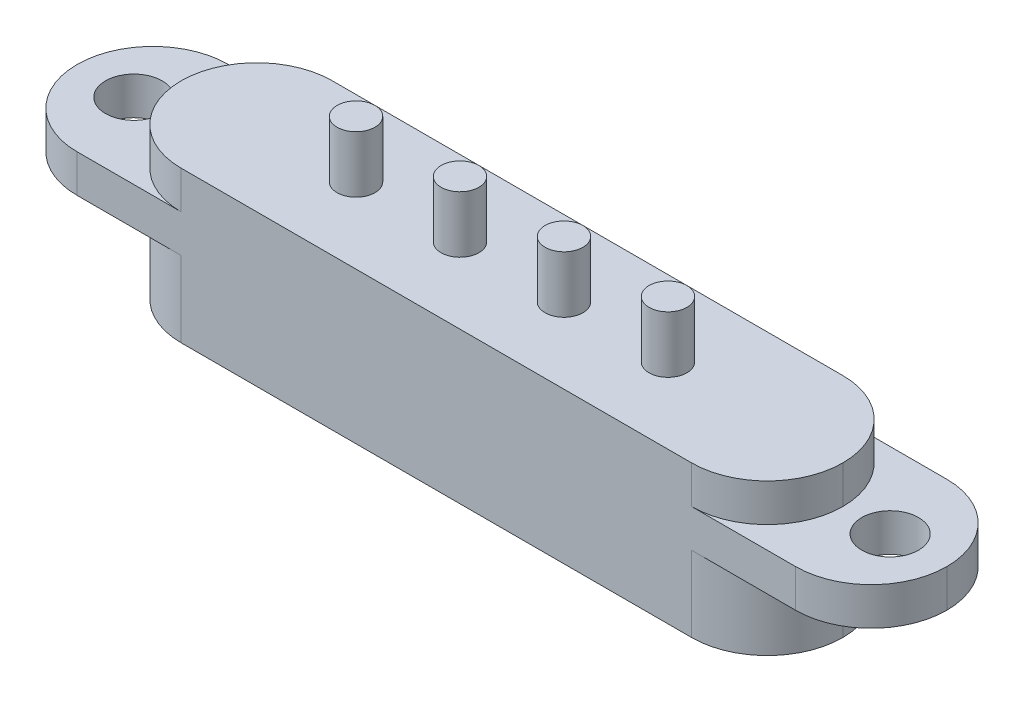
ISO-10303-21;
HEADER;
FILE_DESCRIPTION(('STEP AP214'),'2;1');
FILE_NAME('part.step','',(''),(''),'','','');
FILE_SCHEMA(('AUTOMOTIVE_DESIGN { 1 0 10303 214 1 1 1 1 }'));
ENDSEC;
DATA;
#1=APPLICATION_CONTEXT('core data for automotive mechanical design processes');
#2=APPLICATION_PROTOCOL_DEFINITION('international standard','automotive_design',2000,#1);
#3=PRODUCT_CONTEXT('',#1,'mechanical');
#4=PRODUCT('Part','Part','',(#3));
#5=PRODUCT_RELATED_PRODUCT_CATEGORY('part','',(#4));
#6=PRODUCT_DEFINITION_FORMATION('','',#4);
#7=PRODUCT_DEFINITION_CONTEXT('part definition',#1,'design');
#8=PRODUCT_DEFINITION('design','',#6,#7);
#9=PRODUCT_DEFINITION_SHAPE('','',#8);
#10=(LENGTH_UNIT() NAMED_UNIT(*) SI_UNIT(.MILLI.,.METRE.));
#11=(NAMED_UNIT(*) PLANE_ANGLE_UNIT() SI_UNIT($,.RADIAN.));
#12=(NAMED_UNIT(*) SI_UNIT($,.STERADIAN.) SOLID_ANGLE_UNIT());
#13=UNCERTAINTY_MEASURE_WITH_UNIT(LENGTH_MEASURE(1.E-05),#10,'distance_accuracy_value','');
#14=(GEOMETRIC_REPRESENTATION_CONTEXT(3) GLOBAL_UNCERTAINTY_ASSIGNED_CONTEXT((#13)) GLOBAL_UNIT_ASSIGNED_CONTEXT((#10,
#11,#12)) REPRESENTATION_CONTEXT('',''));
#15=CARTESIAN_POINT('',(0.,0.,0.));
#16=DIRECTION('',(0.,0.,1.));
#17=DIRECTION('',(1.,0.,0.));
#18=AXIS2_PLACEMENT_3D('',#15,#16,#17);
#19=CARTESIAN_POINT('',(0.,0.,0.));
#20=DIRECTION('',(0.,1.,0.));
#21=DIRECTION('',(0.,0.,1.));
#22=AXIS2_PLACEMENT_3D('',#19,#20,#21);
#23=PLANE('',#22);
#24=CARTESIAN_POINT('',(1.5,0.,2.));
#25=DIRECTION('',(0.,1.,0.));
#26=DIRECTION('',(0.,0.,1.));
#27=AXIS2_PLACEMENT_3D('',#24,#25,#26);
#28=CIRCLE('',#27,0.75);
#29=CARTESIAN_POINT('',(1.5,0.,2.75));
#30=VERTEX_POINT('',#29);
#31=EDGE_CURVE('E286',#30,#30,#28,.T.);
#32=ORIENTED_EDGE('',*,*,#31,.T.);
#33=EDGE_LOOP('',(#32));
#34=FACE_BOUND('',#33,.T.);
#35=DIRECTION('',(1.,0.,0.));
#36=VECTOR('',#35,1.);
#37=CARTESIAN_POINT('',(0.,0.,4.));
#38=LINE('',#37,#36);
#39=CARTESIAN_POINT('',(2.,0.,4.));
#40=VERTEX_POINT('',#39);
#41=CARTESIAN_POINT('',(4.75,0.,4.));
#42=VERTEX_POINT('',#41);
#43=EDGE_CURVE('E281',#40,#42,#38,.T.);
#44=ORIENTED_EDGE('',*,*,#43,.F.);
#45=CARTESIAN_POINT('',(2.,0.,2.));
#46=DIRECTION('',(0.,1.,0.));
#47=DIRECTION('',(0.,0.,1.));
#48=AXIS2_PLACEMENT_3D('',#45,#46,#47);
#49=CIRCLE('',#48,2.);
#50=CARTESIAN_POINT('',(0.,0.,2.));
#51=VERTEX_POINT('',#50);
#52=EDGE_CURVE('E254',#40,#51,#49,.F.);
#53=ORIENTED_EDGE('',*,*,#52,.T.);
#54=CARTESIAN_POINT('',(2.,0.,2.));
#55=DIRECTION('',(0.,1.,0.));
#56=DIRECTION('',(0.,0.,1.));
#57=AXIS2_PLACEMENT_3D('',#54,#55,#56);
#58=CIRCLE('',#57,2.);
#59=CARTESIAN_POINT('',(2.,0.,0.));
#60=VERTEX_POINT('',#59);
#61=EDGE_CURVE('E252',#51,#60,#58,.F.);
#62=ORIENTED_EDGE('',*,*,#61,.T.);
#63=DIRECTION('',(-1.,0.,0.));
#64=VECTOR('',#63,1.);
#65=CARTESIAN_POINT('',(0.,0.,0.));
#66=LINE('',#65,#64);
#67=CARTESIAN_POINT('',(4.75,0.,0.));
#68=VERTEX_POINT('',#67);
#69=EDGE_CURVE('E284',#68,#60,#66,.T.);
#70=ORIENTED_EDGE('',*,*,#69,.F.);
#71=CARTESIAN_POINT('',(4.75,0.,2.));
#72=DIRECTION('',(0.,1.,0.));
#73=DIRECTION('',(0.,0.,1.));
#74=AXIS2_PLACEMENT_3D('',#71,#72,#73);
#75=CIRCLE('',#74,2.);
#76=CARTESIAN_POINT('',(2.75,0.,2.));
#77=VERTEX_POINT('',#76);
#78=EDGE_CURVE('E229',#68,#77,#75,.T.);
#79=ORIENTED_EDGE('',*,*,#78,.T.);
#80=CARTESIAN_POINT('',(4.75,0.,2.));
#81=DIRECTION('',(0.,1.,0.));
#82=DIRECTION('',(0.,0.,1.));
#83=AXIS2_PLACEMENT_3D('',#80,#81,#82);
#84=CIRCLE('',#83,2.);
#85=EDGE_CURVE('E231',#77,#42,#84,.T.);
#86=ORIENTED_EDGE('',*,*,#85,.T.);
#87=EDGE_LOOP('',(#44,#53,#62,#70,#79,#86));
#88=FACE_BOUND('',#87,.T.);
#89=ADVANCED_FACE('F33',(#34,#88),#23,.F.);
#90=CARTESIAN_POINT('',(21.5,0.,2.));
#91=DIRECTION('',(0.,1.,0.));
#92=DIRECTION('',(0.,0.,1.));
#93=AXIS2_PLACEMENT_3D('',#90,#91,#92);
#94=CIRCLE('',#93,0.750000000000002);
#95=CARTESIAN_POINT('',(21.5,0.,2.75));
#96=VERTEX_POINT('',#95);
#97=EDGE_CURVE('E326',#96,#96,#94,.T.);
#98=ORIENTED_EDGE('',*,*,#97,.T.);
#99=EDGE_LOOP('',(#98));
#100=FACE_BOUND('',#99,.T.);
#101=CARTESIAN_POINT('',(21.,0.,0.));
#102=VERTEX_POINT('',#101);
#103=CARTESIAN_POINT('',(18.25,0.,0.));
#104=VERTEX_POINT('',#103);
#105=EDGE_CURVE('E292',#102,#104,#66,.T.);
#106=ORIENTED_EDGE('',*,*,#105,.F.);
#107=CARTESIAN_POINT('',(21.,0.,2.));
#108=DIRECTION('',(0.,1.,0.));
#109=DIRECTION('',(0.,0.,1.));
#110=AXIS2_PLACEMENT_3D('',#107,#108,#109);
#111=CIRCLE('',#110,2.);
#112=CARTESIAN_POINT('',(23.,0.,2.));
#113=VERTEX_POINT('',#112);
#114=EDGE_CURVE('E56',#102,#113,#111,.F.);
#115=ORIENTED_EDGE('',*,*,#114,.T.);
#116=CARTESIAN_POINT('',(21.,0.,2.));
#117=DIRECTION('',(0.,1.,0.));
#118=DIRECTION('',(0.,0.,1.));
#119=AXIS2_PLACEMENT_3D('',#116,#117,#118);
#120=CIRCLE('',#119,2.);
#121=CARTESIAN_POINT('',(21.,0.,4.));
#122=VERTEX_POINT('',#121);
#123=EDGE_CURVE('E265',#113,#122,#120,.F.);
#124=ORIENTED_EDGE('',*,*,#123,.T.);
#125=CARTESIAN_POINT('',(18.25,0.,4.));
#126=VERTEX_POINT('',#125);
#127=EDGE_CURVE('E280',#126,#122,#38,.T.);
#128=ORIENTED_EDGE('',*,*,#127,.F.);
#129=CARTESIAN_POINT('',(18.25,0.,2.));
#130=DIRECTION('',(0.,1.,0.));
#131=DIRECTION('',(0.,0.,1.));
#132=AXIS2_PLACEMENT_3D('',#129,#130,#131);
#133=CIRCLE('',#132,2.);
#134=CARTESIAN_POINT('',(20.25,0.,2.));
#135=VERTEX_POINT('',#134);
#136=EDGE_CURVE('E186',#126,#135,#133,.T.);
#137=ORIENTED_EDGE('',*,*,#136,.T.);
#138=CARTESIAN_POINT('',(18.25,0.,2.));
#139=DIRECTION('',(0.,1.,0.));
#140=DIRECTION('',(0.,0.,1.));
#141=AXIS2_PLACEMENT_3D('',#138,#139,#140);
#142=CIRCLE('',#141,2.);
#143=EDGE_CURVE('E216',#135,#104,#142,.T.);
#144=ORIENTED_EDGE('',*,*,#143,.T.);
#145=EDGE_LOOP('',(#106,#115,#124,#128,#137,#144));
#146=FACE_BOUND('',#145,.T.);
#147=ADVANCED_FACE('F279',(#100,#146),#23,.F.);
#148=CARTESIAN_POINT('',(0.,1.,0.));
#149=DIRECTION('',(0.,1.,0.));
#150=DIRECTION('',(0.,0.,1.));
#151=AXIS2_PLACEMENT_3D('',#148,#149,#150);
#152=PLANE('',#151);
#153=CARTESIAN_POINT('',(2.,1.,2.));
#154=DIRECTION('',(0.,1.,0.));
#155=DIRECTION('',(0.,0.,1.));
#156=AXIS2_PLACEMENT_3D('',#153,#154,#155);
#157=CIRCLE('',#156,2.);
#158=CARTESIAN_POINT('',(2.,1.,0.));
#159=VERTEX_POINT('',#158);
#160=CARTESIAN_POINT('',(0.,1.,2.));
#161=VERTEX_POINT('',#160);
#162=EDGE_CURVE('E256',#159,#161,#157,.T.);
#163=ORIENTED_EDGE('',*,*,#162,.T.);
#164=CARTESIAN_POINT('',(2.,1.,2.));
#165=DIRECTION('',(0.,1.,0.));
#166=DIRECTION('',(0.,0.,1.));
#167=AXIS2_PLACEMENT_3D('',#164,#165,#166);
#168=CIRCLE('',#167,2.);
#169=CARTESIAN_POINT('',(2.,1.,4.));
#170=VERTEX_POINT('',#169);
#171=EDGE_CURVE('E258',#161,#170,#168,.T.);
#172=ORIENTED_EDGE('',*,*,#171,.T.);
#173=DIRECTION('',(1.,0.,0.));
#174=VECTOR('',#173,1.);
#175=CARTESIAN_POINT('',(0.,1.,4.));
#176=LINE('',#175,#174);
#177=CARTESIAN_POINT('',(4.75,1.,4.));
#178=VERTEX_POINT('',#177);
#179=EDGE_CURVE('E298',#170,#178,#176,.T.);
#180=ORIENTED_EDGE('',*,*,#179,.T.);
#181=CARTESIAN_POINT('',(4.75,1.,2.));
#182=DIRECTION('',(0.,1.,0.));
#183=DIRECTION('',(0.,0.,1.));
#184=AXIS2_PLACEMENT_3D('',#181,#182,#183);
#185=CIRCLE('',#184,2.);
#186=CARTESIAN_POINT('',(2.75,1.,2.));
#187=VERTEX_POINT('',#186);
#188=EDGE_CURVE('E224',#178,#187,#185,.F.);
#189=ORIENTED_EDGE('',*,*,#188,.T.);
#190=CARTESIAN_POINT('',(4.75,1.,2.));
#191=DIRECTION('',(0.,1.,0.));
#192=DIRECTION('',(0.,0.,1.));
#193=AXIS2_PLACEMENT_3D('',#190,#191,#192);
#194=CIRCLE('',#193,2.);
#195=CARTESIAN_POINT('',(4.75,1.,0.));
#196=VERTEX_POINT('',#195);
#197=EDGE_CURVE('E226',#187,#196,#194,.F.);
#198=ORIENTED_EDGE('',*,*,#197,.T.);
#199=DIRECTION('',(-1.,0.,0.));
#200=VECTOR('',#199,1.);
#201=CARTESIAN_POINT('',(0.,1.,0.));
#202=LINE('',#201,#200);
#203=EDGE_CURVE('E322',#196,#159,#202,.T.);
#204=ORIENTED_EDGE('',*,*,#203,.T.);
#205=EDGE_LOOP('',(#163,#172,#180,#189,#198,#204));
#206=FACE_BOUND('',#205,.T.);
#207=CARTESIAN_POINT('',(1.5,1.,2.));
#208=DIRECTION('',(0.,1.,0.));
#209=DIRECTION('',(0.,0.,1.));
#210=AXIS2_PLACEMENT_3D('',#207,#208,#209);
#211=CIRCLE('',#210,0.75);
#212=CARTESIAN_POINT('',(1.5,1.,2.75));
#213=VERTEX_POINT('',#212);
#214=EDGE_CURVE('E282',#213,#213,#211,.T.);
#215=ORIENTED_EDGE('',*,*,#214,.F.);
#216=EDGE_LOOP('',(#215));
#217=FACE_BOUND('',#216,.T.);
#218=ADVANCED_FACE('F308',(#206,#217),#152,.T.);
#219=CARTESIAN_POINT('',(21.,1.,2.));
#220=DIRECTION('',(0.,1.,0.));
#221=DIRECTION('',(0.,0.,1.));
#222=AXIS2_PLACEMENT_3D('',#219,#220,#221);
#223=CIRCLE('',#222,2.);
#224=CARTESIAN_POINT('',(21.,1.,4.));
#225=VERTEX_POINT('',#224);
#226=CARTESIAN_POINT('',(23.,1.,2.));
#227=VERTEX_POINT('',#226);
#228=EDGE_CURVE('E42',#225,#227,#223,.T.);
#229=ORIENTED_EDGE('',*,*,#228,.T.);
#230=CARTESIAN_POINT('',(21.,1.,2.));
#231=DIRECTION('',(0.,1.,0.));
#232=DIRECTION('',(0.,0.,1.));
#233=AXIS2_PLACEMENT_3D('',#230,#231,#232);
#234=CIRCLE('',#233,2.);
#235=CARTESIAN_POINT('',(21.,1.,0.));
#236=VERTEX_POINT('',#235);
#237=EDGE_CURVE('E11',#227,#236,#234,.T.);
#238=ORIENTED_EDGE('',*,*,#237,.T.);
#239=CARTESIAN_POINT('',(18.25,1.,0.));
#240=VERTEX_POINT('',#239);
#241=EDGE_CURVE('E290',#236,#240,#202,.T.);
#242=ORIENTED_EDGE('',*,*,#241,.T.);
#243=CARTESIAN_POINT('',(18.25,1.,2.));
#244=DIRECTION('',(0.,1.,0.));
#245=DIRECTION('',(0.,0.,1.));
#246=AXIS2_PLACEMENT_3D('',#243,#244,#245);
#247=CIRCLE('',#246,2.);
#248=CARTESIAN_POINT('',(20.25,1.,2.));
#249=VERTEX_POINT('',#248);
#250=EDGE_CURVE('E219',#240,#249,#247,.F.);
#251=ORIENTED_EDGE('',*,*,#250,.T.);
#252=CARTESIAN_POINT('',(18.25,1.,2.));
#253=DIRECTION('',(0.,1.,0.));
#254=DIRECTION('',(0.,0.,1.));
#255=AXIS2_PLACEMENT_3D('',#252,#253,#254);
#256=CIRCLE('',#255,2.);
#257=CARTESIAN_POINT('',(18.25,1.,4.));
#258=VERTEX_POINT('',#257);
#259=EDGE_CURVE('E221',#249,#258,#256,.F.);
#260=ORIENTED_EDGE('',*,*,#259,.T.);
#261=EDGE_CURVE('E294',#258,#225,#176,.T.);
#262=ORIENTED_EDGE('',*,*,#261,.T.);
#263=EDGE_LOOP('',(#229,#238,#242,#251,#260,#262));
#264=FACE_BOUND('',#263,.T.);
#265=CARTESIAN_POINT('',(21.5,1.,2.));
#266=DIRECTION('',(0.,1.,0.));
#267=DIRECTION('',(0.,0.,1.));
#268=AXIS2_PLACEMENT_3D('',#265,#266,#267);
#269=CIRCLE('',#268,0.750000000000002);
#270=CARTESIAN_POINT('',(21.5,1.,2.75));
#271=VERTEX_POINT('',#270);
#272=EDGE_CURVE('E329',#271,#271,#269,.T.);
#273=ORIENTED_EDGE('',*,*,#272,.F.);
#274=EDGE_LOOP('',(#273));
#275=FACE_BOUND('',#274,.T.);
#276=ADVANCED_FACE('F336',(#264,#275),#152,.T.);
#277=CARTESIAN_POINT('',(0.,1.,4.));
#278=DIRECTION('',(0.,0.,-1.));
#279=DIRECTION('',(-1.,0.,0.));
#280=AXIS2_PLACEMENT_3D('',#277,#278,#279);
#281=PLANE('',#280);
#282=ORIENTED_EDGE('',*,*,#179,.F.);
#283=DIRECTION('',(0.,-1.,0.));
#284=VECTOR('',#283,1.);
#285=CARTESIAN_POINT('',(2.,1.,4.));
#286=LINE('',#285,#284);
#287=EDGE_CURVE('E249',#170,#40,#286,.T.);
#288=ORIENTED_EDGE('',*,*,#287,.T.);
#289=ORIENTED_EDGE('',*,*,#43,.T.);
#290=DIRECTION('',(0.,1.,0.));
#291=VECTOR('',#290,1.);
#292=CARTESIAN_POINT('',(4.75,1.,4.));
#293=LINE('',#292,#291);
#294=CARTESIAN_POINT('',(4.75,-2.,4.));
#295=VERTEX_POINT('',#294);
#296=EDGE_CURVE('E180',#42,#295,#293,.F.);
#297=ORIENTED_EDGE('',*,*,#296,.T.);
#298=DIRECTION('',(-1.,0.,0.));
#299=VECTOR('',#298,1.);
#300=CARTESIAN_POINT('',(2.75,-2.,4.));
#301=LINE('',#300,#299);
#302=CARTESIAN_POINT('',(18.25,-2.,4.));
#303=VERTEX_POINT('',#302);
#304=EDGE_CURVE('E162',#303,#295,#301,.T.);
#305=ORIENTED_EDGE('',*,*,#304,.F.);
#306=DIRECTION('',(0.,1.,0.));
#307=VECTOR('',#306,1.);
#308=CARTESIAN_POINT('',(18.25,1.,4.));
#309=LINE('',#308,#307);
#310=EDGE_CURVE('E178',#303,#126,#309,.T.);
#311=ORIENTED_EDGE('',*,*,#310,.T.);
#312=ORIENTED_EDGE('',*,*,#127,.T.);
#313=DIRECTION('',(0.,-1.,0.));
#314=VECTOR('',#313,1.);
#315=CARTESIAN_POINT('',(21.,1.,4.));
#316=LINE('',#315,#314);
#317=EDGE_CURVE('E234',#122,#225,#316,.F.);
#318=ORIENTED_EDGE('',*,*,#317,.T.);
#319=ORIENTED_EDGE('',*,*,#261,.F.);
#320=DIRECTION('',(0.,-1.,0.));
#321=VECTOR('',#320,1.);
#322=CARTESIAN_POINT('',(18.25,1.,4.));
#323=LINE('',#322,#321);
#324=CARTESIAN_POINT('',(18.25,2.,4.));
#325=VERTEX_POINT('',#324);
#326=EDGE_CURVE('E188',#258,#325,#323,.F.);
#327=ORIENTED_EDGE('',*,*,#326,.T.);
#328=DIRECTION('',(1.,0.,0.));
#329=VECTOR('',#328,1.);
#330=CARTESIAN_POINT('',(2.75,2.,4.));
#331=LINE('',#330,#329);
#332=CARTESIAN_POINT('',(4.75,2.,4.));
#333=VERTEX_POINT('',#332);
#334=EDGE_CURVE('E181',#333,#325,#331,.T.);
#335=ORIENTED_EDGE('',*,*,#334,.F.);
#336=DIRECTION('',(0.,-1.,0.));
#337=VECTOR('',#336,1.);
#338=CARTESIAN_POINT('',(4.75,1.,4.));
#339=LINE('',#338,#337);
#340=EDGE_CURVE('E192',#333,#178,#339,.T.);
#341=ORIENTED_EDGE('',*,*,#340,.T.);
#342=EDGE_LOOP('',(#282,#288,#289,#297,#305,#311,#312,#318,#319,#327,#335,#341));
#343=FACE_BOUND('',#342,.T.);
#344=ADVANCED_FACE('F176',(#343),#281,.F.);
#345=CARTESIAN_POINT('',(0.,1.,0.));
#346=DIRECTION('',(0.,0.,1.));
#347=DIRECTION('',(1.,0.,0.));
#348=AXIS2_PLACEMENT_3D('',#345,#346,#347);
#349=PLANE('',#348);
#350=ORIENTED_EDGE('',*,*,#69,.T.);
#351=DIRECTION('',(0.,-1.,0.));
#352=VECTOR('',#351,1.);
#353=CARTESIAN_POINT('',(2.,1.,0.));
#354=LINE('',#353,#352);
#355=EDGE_CURVE('E263',#60,#159,#354,.F.);
#356=ORIENTED_EDGE('',*,*,#355,.T.);
#357=ORIENTED_EDGE('',*,*,#203,.F.);
#358=DIRECTION('',(0.,-1.,0.));
#359=VECTOR('',#358,1.);
#360=CARTESIAN_POINT('',(4.75,1.,0.));
#361=LINE('',#360,#359);
#362=CARTESIAN_POINT('',(4.75,2.,0.));
#363=VERTEX_POINT('',#362);
#364=EDGE_CURVE('E200',#196,#363,#361,.F.);
#365=ORIENTED_EDGE('',*,*,#364,.T.);
#366=DIRECTION('',(-1.,0.,0.));
#367=VECTOR('',#366,1.);
#368=CARTESIAN_POINT('',(2.75,2.,0.));
#369=LINE('',#368,#367);
#370=CARTESIAN_POINT('',(18.25,2.,0.));
#371=VERTEX_POINT('',#370);
#372=EDGE_CURVE('E320',#371,#363,#369,.T.);
#373=ORIENTED_EDGE('',*,*,#372,.F.);
#374=DIRECTION('',(0.,-1.,0.));
#375=VECTOR('',#374,1.);
#376=CARTESIAN_POINT('',(18.25,1.,0.));
#377=LINE('',#376,#375);
#378=EDGE_CURVE('E202',#371,#240,#377,.T.);
#379=ORIENTED_EDGE('',*,*,#378,.T.);
#380=ORIENTED_EDGE('',*,*,#241,.F.);
#381=DIRECTION('',(0.,-1.,0.));
#382=VECTOR('',#381,1.);
#383=CARTESIAN_POINT('',(21.,1.,0.));
#384=LINE('',#383,#382);
#385=EDGE_CURVE('E260',#236,#102,#384,.T.);
#386=ORIENTED_EDGE('',*,*,#385,.T.);
#387=ORIENTED_EDGE('',*,*,#105,.T.);
#388=DIRECTION('',(0.,1.,0.));
#389=VECTOR('',#388,1.);
#390=CARTESIAN_POINT('',(18.25,1.,0.));
#391=LINE('',#390,#389);
#392=CARTESIAN_POINT('',(18.25,-2.,0.));
#393=VERTEX_POINT('',#392);
#394=EDGE_CURVE('E205',#104,#393,#391,.F.);
#395=ORIENTED_EDGE('',*,*,#394,.T.);
#396=DIRECTION('',(1.,0.,0.));
#397=VECTOR('',#396,1.);
#398=CARTESIAN_POINT('',(2.75,-2.,0.));
#399=LINE('',#398,#397);
#400=CARTESIAN_POINT('',(4.75,-2.,0.));
#401=VERTEX_POINT('',#400);
#402=EDGE_CURVE('E182',#401,#393,#399,.T.);
#403=ORIENTED_EDGE('',*,*,#402,.F.);
#404=DIRECTION('',(0.,1.,0.));
#405=VECTOR('',#404,1.);
#406=CARTESIAN_POINT('',(4.75,1.,0.));
#407=LINE('',#406,#405);
#408=EDGE_CURVE('E171',#401,#68,#407,.T.);
#409=ORIENTED_EDGE('',*,*,#408,.T.);
#410=EDGE_LOOP('',(#350,#356,#357,#365,#373,#379,#380,#386,#387,#395,#403,#409));
#411=FACE_BOUND('',#410,.T.);
#412=ADVANCED_FACE('F319',(#411),#349,.F.);
#413=CARTESIAN_POINT('',(1.5,1.,2.));
#414=DIRECTION('',(0.,-1.,0.));
#415=DIRECTION('',(0.,0.,-1.));
#416=AXIS2_PLACEMENT_3D('',#413,#414,#415);
#417=CYLINDRICAL_SURFACE('',#416,0.75);
#418=ORIENTED_EDGE('',*,*,#214,.T.);
#419=EDGE_LOOP('',(#418));
#420=FACE_BOUND('',#419,.T.);
#421=ORIENTED_EDGE('',*,*,#31,.F.);
#422=EDGE_LOOP('',(#421));
#423=FACE_BOUND('',#422,.T.);
#424=ADVANCED_FACE('F427',(#420,#423),#417,.F.);
#425=CARTESIAN_POINT('',(21.5,1.,2.));
#426=DIRECTION('',(0.,-1.,0.));
#427=DIRECTION('',(0.,0.,-1.));
#428=AXIS2_PLACEMENT_3D('',#425,#426,#427);
#429=CYLINDRICAL_SURFACE('',#428,0.750000000000002);
#430=ORIENTED_EDGE('',*,*,#272,.T.);
#431=EDGE_LOOP('',(#430));
#432=FACE_BOUND('',#431,.T.);
#433=ORIENTED_EDGE('',*,*,#97,.F.);
#434=EDGE_LOOP('',(#433));
#435=FACE_BOUND('',#434,.T.);
#436=ADVANCED_FACE('F392',(#432,#435),#429,.F.);
#437=CARTESIAN_POINT('',(0.,2.,0.));
#438=DIRECTION('',(0.,1.,0.));
#439=DIRECTION('',(0.,0.,1.));
#440=AXIS2_PLACEMENT_3D('',#437,#438,#439);
#441=PLANE('',#440);
#442=CARTESIAN_POINT('',(15.625,2.,2.));
#443=DIRECTION('',(0.,1.,0.));
#444=DIRECTION('',(0.,0.,1.));
#445=AXIS2_PLACEMENT_3D('',#442,#443,#444);
#446=CIRCLE('',#445,0.499999999999995);
#447=CARTESIAN_POINT('',(15.625,2.,2.5));
#448=VERTEX_POINT('',#447);
#449=EDGE_CURVE('E237',#448,#448,#446,.T.);
#450=ORIENTED_EDGE('',*,*,#449,.F.);
#451=EDGE_LOOP('',(#450));
#452=FACE_BOUND('',#451,.T.);
#453=CARTESIAN_POINT('',(12.875,2.,2.));
#454=DIRECTION('',(0.,1.,0.));
#455=DIRECTION('',(0.,0.,1.));
#456=AXIS2_PLACEMENT_3D('',#453,#454,#455);
#457=CIRCLE('',#456,0.500000000000001);
#458=CARTESIAN_POINT('',(12.875,2.,2.5));
#459=VERTEX_POINT('',#458);
#460=EDGE_CURVE('E370',#459,#459,#457,.T.);
#461=ORIENTED_EDGE('',*,*,#460,.F.);
#462=EDGE_LOOP('',(#461));
#463=FACE_BOUND('',#462,.T.);
#464=CARTESIAN_POINT('',(10.125,2.,2.));
#465=DIRECTION('',(0.,1.,0.));
#466=DIRECTION('',(0.,0.,1.));
#467=AXIS2_PLACEMENT_3D('',#464,#465,#466);
#468=CIRCLE('',#467,0.500000000000001);
#469=CARTESIAN_POINT('',(10.125,2.,2.5));
#470=VERTEX_POINT('',#469);
#471=EDGE_CURVE('E364',#470,#470,#468,.T.);
#472=ORIENTED_EDGE('',*,*,#471,.F.);
#473=EDGE_LOOP('',(#472));
#474=FACE_BOUND('',#473,.T.);
#475=CARTESIAN_POINT('',(7.375,2.,2.));
#476=DIRECTION('',(0.,1.,0.));
#477=DIRECTION('',(0.,0.,1.));
#478=AXIS2_PLACEMENT_3D('',#475,#476,#477);
#479=CIRCLE('',#478,0.500000000000002);
#480=CARTESIAN_POINT('',(7.375,2.,2.5));
#481=VERTEX_POINT('',#480);
#482=EDGE_CURVE('E358',#481,#481,#479,.T.);
#483=ORIENTED_EDGE('',*,*,#482,.F.);
#484=EDGE_LOOP('',(#483));
#485=FACE_BOUND('',#484,.T.);
#486=CARTESIAN_POINT('',(18.25,2.,2.));
#487=DIRECTION('',(0.,1.,0.));
#488=DIRECTION('',(0.,0.,1.));
#489=AXIS2_PLACEMENT_3D('',#486,#487,#488);
#490=CIRCLE('',#489,2.);
#491=CARTESIAN_POINT('',(20.25,2.,2.));
#492=VERTEX_POINT('',#491);
#493=EDGE_CURVE('E211',#325,#492,#490,.T.);
#494=ORIENTED_EDGE('',*,*,#493,.T.);
#495=CARTESIAN_POINT('',(18.25,2.,2.));
#496=DIRECTION('',(0.,1.,0.));
#497=DIRECTION('',(0.,0.,1.));
#498=AXIS2_PLACEMENT_3D('',#495,#496,#497);
#499=CIRCLE('',#498,2.);
#500=EDGE_CURVE('E213',#492,#371,#499,.T.);
#501=ORIENTED_EDGE('',*,*,#500,.T.);
#502=ORIENTED_EDGE('',*,*,#372,.T.);
#503=CARTESIAN_POINT('',(4.75,2.,2.));
#504=DIRECTION('',(0.,1.,0.));
#505=DIRECTION('',(0.,0.,1.));
#506=AXIS2_PLACEMENT_3D('',#503,#504,#505);
#507=CIRCLE('',#506,2.);
#508=CARTESIAN_POINT('',(2.75,2.,2.));
#509=VERTEX_POINT('',#508);
#510=EDGE_CURVE('E207',#363,#509,#507,.T.);
#511=ORIENTED_EDGE('',*,*,#510,.T.);
#512=CARTESIAN_POINT('',(4.75,2.,2.));
#513=DIRECTION('',(0.,1.,0.));
#514=DIRECTION('',(0.,0.,1.));
#515=AXIS2_PLACEMENT_3D('',#512,#513,#514);
#516=CIRCLE('',#515,2.);
#517=EDGE_CURVE('E209',#509,#333,#516,.T.);
#518=ORIENTED_EDGE('',*,*,#517,.T.);
#519=ORIENTED_EDGE('',*,*,#334,.T.);
#520=EDGE_LOOP('',(#494,#501,#502,#511,#518,#519));
#521=FACE_BOUND('',#520,.T.);
#522=ADVANCED_FACE('F324',(#452,#463,#474,#485,#521),#441,.T.);
#523=CARTESIAN_POINT('',(0.,-2.,0.));
#524=DIRECTION('',(0.,-1.,0.));
#525=DIRECTION('',(0.,0.,-1.));
#526=AXIS2_PLACEMENT_3D('',#523,#524,#525);
#527=PLANE('',#526);
#528=CARTESIAN_POINT('',(18.25,-2.,2.));
#529=DIRECTION('',(0.,-1.,0.));
#530=DIRECTION('',(0.,0.,-1.));
#531=AXIS2_PLACEMENT_3D('',#528,#529,#530);
#532=CIRCLE('',#531,2.);
#533=CARTESIAN_POINT('',(20.25,-2.,2.));
#534=VERTEX_POINT('',#533);
#535=EDGE_CURVE('E166',#393,#534,#532,.T.);
#536=ORIENTED_EDGE('',*,*,#535,.T.);
#537=CARTESIAN_POINT('',(18.25,-2.,2.));
#538=DIRECTION('',(0.,-1.,0.));
#539=DIRECTION('',(0.,0.,-1.));
#540=AXIS2_PLACEMENT_3D('',#537,#538,#539);
#541=CIRCLE('',#540,2.);
#542=EDGE_CURVE('E159',#534,#303,#541,.T.);
#543=ORIENTED_EDGE('',*,*,#542,.T.);
#544=ORIENTED_EDGE('',*,*,#304,.T.);
#545=CARTESIAN_POINT('',(4.75,-2.,2.));
#546=DIRECTION('',(0.,-1.,0.));
#547=DIRECTION('',(0.,0.,-1.));
#548=AXIS2_PLACEMENT_3D('',#545,#546,#547);
#549=CIRCLE('',#548,2.);
#550=CARTESIAN_POINT('',(2.75,-2.,2.));
#551=VERTEX_POINT('',#550);
#552=EDGE_CURVE('E187',#295,#551,#549,.T.);
#553=ORIENTED_EDGE('',*,*,#552,.T.);
#554=CARTESIAN_POINT('',(4.75,-2.,2.));
#555=DIRECTION('',(0.,-1.,0.));
#556=DIRECTION('',(0.,0.,-1.));
#557=AXIS2_PLACEMENT_3D('',#554,#555,#556);
#558=CIRCLE('',#557,2.);
#559=EDGE_CURVE('E190',#551,#401,#558,.T.);
#560=ORIENTED_EDGE('',*,*,#559,.T.);
#561=ORIENTED_EDGE('',*,*,#402,.T.);
#562=EDGE_LOOP('',(#536,#543,#544,#553,#560,#561));
#563=FACE_BOUND('',#562,.T.);
#564=ADVANCED_FACE('F161',(#563),#527,.T.);
#565=CARTESIAN_POINT('',(7.375,3.5,2.));
#566=DIRECTION('',(0.,-1.,0.));
#567=DIRECTION('',(0.,0.,-1.));
#568=AXIS2_PLACEMENT_3D('',#565,#566,#567);
#569=CYLINDRICAL_SURFACE('',#568,0.500000000000002);
#570=CARTESIAN_POINT('',(7.375,3.5,2.));
#571=DIRECTION('',(0.,1.,0.));
#572=DIRECTION('',(0.,0.,1.));
#573=AXIS2_PLACEMENT_3D('',#570,#571,#572);
#574=CIRCLE('',#573,0.500000000000002);
#575=CARTESIAN_POINT('',(7.375,3.5,2.5));
#576=VERTEX_POINT('',#575);
#577=EDGE_CURVE('E355',#576,#576,#574,.T.);
#578=ORIENTED_EDGE('',*,*,#577,.F.);
#579=EDGE_LOOP('',(#578));
#580=FACE_BOUND('',#579,.T.);
#581=ORIENTED_EDGE('',*,*,#482,.T.);
#582=EDGE_LOOP('',(#581));
#583=FACE_BOUND('',#582,.T.);
#584=ADVANCED_FACE('F400',(#580,#583),#569,.T.);
#585=CARTESIAN_POINT('',(7.375,3.5,2.));
#586=DIRECTION('',(0.,1.,0.));
#587=DIRECTION('',(0.,0.,1.));
#588=AXIS2_PLACEMENT_3D('',#585,#586,#587);
#589=PLANE('',#588);
#590=ORIENTED_EDGE('',*,*,#577,.T.);
#591=EDGE_LOOP('',(#590));
#592=FACE_BOUND('',#591,.T.);
#593=ADVANCED_FACE('F402',(#592),#589,.T.);
#594=CARTESIAN_POINT('',(10.125,3.5,2.));
#595=DIRECTION('',(0.,-1.,0.));
#596=DIRECTION('',(0.,0.,-1.));
#597=AXIS2_PLACEMENT_3D('',#594,#595,#596);
#598=CYLINDRICAL_SURFACE('',#597,0.500000000000001);
#599=CARTESIAN_POINT('',(10.125,3.5,2.));
#600=DIRECTION('',(0.,1.,0.));
#601=DIRECTION('',(0.,0.,1.));
#602=AXIS2_PLACEMENT_3D('',#599,#600,#601);
#603=CIRCLE('',#602,0.500000000000001);
#604=CARTESIAN_POINT('',(10.125,3.5,2.5));
#605=VERTEX_POINT('',#604);
#606=EDGE_CURVE('E362',#605,#605,#603,.T.);
#607=ORIENTED_EDGE('',*,*,#606,.F.);
#608=EDGE_LOOP('',(#607));
#609=FACE_BOUND('',#608,.T.);
#610=ORIENTED_EDGE('',*,*,#471,.T.);
#611=EDGE_LOOP('',(#610));
#612=FACE_BOUND('',#611,.T.);
#613=ADVANCED_FACE('F409',(#609,#612),#598,.T.);
#614=CARTESIAN_POINT('',(10.125,3.5,2.));
#615=DIRECTION('',(0.,1.,0.));
#616=DIRECTION('',(0.,0.,1.));
#617=AXIS2_PLACEMENT_3D('',#614,#615,#616);
#618=PLANE('',#617);
#619=ORIENTED_EDGE('',*,*,#606,.T.);
#620=EDGE_LOOP('',(#619));
#621=FACE_BOUND('',#620,.T.);
#622=ADVANCED_FACE('F529',(#621),#618,.T.);
#623=CARTESIAN_POINT('',(12.875,3.5,2.));
#624=DIRECTION('',(0.,-1.,0.));
#625=DIRECTION('',(0.,0.,-1.));
#626=AXIS2_PLACEMENT_3D('',#623,#624,#625);
#627=CYLINDRICAL_SURFACE('',#626,0.500000000000001);
#628=CARTESIAN_POINT('',(12.875,3.5,2.));
#629=DIRECTION('',(0.,1.,0.));
#630=DIRECTION('',(0.,0.,1.));
#631=AXIS2_PLACEMENT_3D('',#628,#629,#630);
#632=CIRCLE('',#631,0.500000000000001);
#633=CARTESIAN_POINT('',(12.875,3.5,2.5));
#634=VERTEX_POINT('',#633);
#635=EDGE_CURVE('E367',#634,#634,#632,.T.);
#636=ORIENTED_EDGE('',*,*,#635,.F.);
#637=EDGE_LOOP('',(#636));
#638=FACE_BOUND('',#637,.T.);
#639=ORIENTED_EDGE('',*,*,#460,.T.);
#640=EDGE_LOOP('',(#639));
#641=FACE_BOUND('',#640,.T.);
#642=ADVANCED_FACE('F521',(#638,#641),#627,.T.);
#643=CARTESIAN_POINT('',(12.875,3.5,2.));
#644=DIRECTION('',(0.,1.,0.));
#645=DIRECTION('',(0.,0.,1.));
#646=AXIS2_PLACEMENT_3D('',#643,#644,#645);
#647=PLANE('',#646);
#648=ORIENTED_EDGE('',*,*,#635,.T.);
#649=EDGE_LOOP('',(#648));
#650=FACE_BOUND('',#649,.T.);
#651=ADVANCED_FACE('F386',(#650),#647,.T.);
#652=CARTESIAN_POINT('',(15.625,3.5,2.));
#653=DIRECTION('',(0.,-1.,0.));
#654=DIRECTION('',(0.,0.,-1.));
#655=AXIS2_PLACEMENT_3D('',#652,#653,#654);
#656=CYLINDRICAL_SURFACE('',#655,0.499999999999995);
#657=CARTESIAN_POINT('',(15.625,3.5,2.));
#658=DIRECTION('',(0.,1.,0.));
#659=DIRECTION('',(0.,0.,1.));
#660=AXIS2_PLACEMENT_3D('',#657,#658,#659);
#661=CIRCLE('',#660,0.499999999999995);
#662=CARTESIAN_POINT('',(15.625,3.5,2.5));
#663=VERTEX_POINT('',#662);
#664=EDGE_CURVE('E373',#663,#663,#661,.T.);
#665=ORIENTED_EDGE('',*,*,#664,.F.);
#666=EDGE_LOOP('',(#665));
#667=FACE_BOUND('',#666,.T.);
#668=ORIENTED_EDGE('',*,*,#449,.T.);
#669=EDGE_LOOP('',(#668));
#670=FACE_BOUND('',#669,.T.);
#671=ADVANCED_FACE('F383',(#667,#670),#656,.T.);
#672=CARTESIAN_POINT('',(15.625,3.5,2.));
#673=DIRECTION('',(0.,1.,0.));
#674=DIRECTION('',(0.,0.,1.));
#675=AXIS2_PLACEMENT_3D('',#672,#673,#674);
#676=PLANE('',#675);
#677=ORIENTED_EDGE('',*,*,#664,.T.);
#678=EDGE_LOOP('',(#677));
#679=FACE_BOUND('',#678,.T.);
#680=ADVANCED_FACE('F381',(#679),#676,.T.);
#681=CARTESIAN_POINT('',(18.25,-2.,2.));
#682=DIRECTION('',(0.,1.,0.));
#683=DIRECTION('',(0.,0.,1.));
#684=AXIS2_PLACEMENT_3D('',#681,#682,#683);
#685=CYLINDRICAL_SURFACE('',#684,2.);
#686=DIRECTION('',(0.,1.,0.));
#687=VECTOR('',#686,1.);
#688=CARTESIAN_POINT('',(20.25,-2.,2.));
#689=LINE('',#688,#687);
#690=EDGE_CURVE('E235',#534,#135,#689,.T.);
#691=ORIENTED_EDGE('',*,*,#690,.F.);
#692=ORIENTED_EDGE('',*,*,#535,.F.);
#693=ORIENTED_EDGE('',*,*,#394,.F.);
#694=ORIENTED_EDGE('',*,*,#143,.F.);
#695=EDGE_LOOP('',(#691,#692,#693,#694));
#696=FACE_BOUND('',#695,.T.);
#697=ADVANCED_FACE('F351',(#696),#685,.T.);
#698=CARTESIAN_POINT('',(18.25,1.,2.));
#699=DIRECTION('',(0.,1.,0.));
#700=DIRECTION('',(0.,0.,1.));
#701=AXIS2_PLACEMENT_3D('',#698,#699,#700);
#702=CYLINDRICAL_SURFACE('',#701,2.);
#703=ORIENTED_EDGE('',*,*,#542,.F.);
#704=ORIENTED_EDGE('',*,*,#690,.T.);
#705=ORIENTED_EDGE('',*,*,#136,.F.);
#706=ORIENTED_EDGE('',*,*,#310,.F.);
#707=EDGE_LOOP('',(#703,#704,#705,#706));
#708=FACE_BOUND('',#707,.T.);
#709=ADVANCED_FACE('F185',(#708),#702,.T.);
#710=CARTESIAN_POINT('',(18.25,2.,2.));
#711=DIRECTION('',(0.,-1.,0.));
#712=DIRECTION('',(0.,0.,-1.));
#713=AXIS2_PLACEMENT_3D('',#710,#711,#712);
#714=CYLINDRICAL_SURFACE('',#713,2.);
#715=DIRECTION('',(0.,-1.,0.));
#716=VECTOR('',#715,1.);
#717=CARTESIAN_POINT('',(20.25,2.,2.));
#718=LINE('',#717,#716);
#719=EDGE_CURVE('E238',#492,#249,#718,.T.);
#720=ORIENTED_EDGE('',*,*,#719,.F.);
#721=ORIENTED_EDGE('',*,*,#493,.F.);
#722=ORIENTED_EDGE('',*,*,#326,.F.);
#723=ORIENTED_EDGE('',*,*,#259,.F.);
#724=EDGE_LOOP('',(#720,#721,#722,#723));
#725=FACE_BOUND('',#724,.T.);
#726=ADVANCED_FACE('F343',(#725),#714,.T.);
#727=CARTESIAN_POINT('',(18.25,1.,2.));
#728=DIRECTION('',(0.,-1.,0.));
#729=DIRECTION('',(0.,0.,-1.));
#730=AXIS2_PLACEMENT_3D('',#727,#728,#729);
#731=CYLINDRICAL_SURFACE('',#730,2.);
#732=ORIENTED_EDGE('',*,*,#500,.F.);
#733=ORIENTED_EDGE('',*,*,#719,.T.);
#734=ORIENTED_EDGE('',*,*,#250,.F.);
#735=ORIENTED_EDGE('',*,*,#378,.F.);
#736=EDGE_LOOP('',(#732,#733,#734,#735));
#737=FACE_BOUND('',#736,.T.);
#738=ADVANCED_FACE('F346',(#737),#731,.T.);
#739=CARTESIAN_POINT('',(4.75,2.,2.));
#740=DIRECTION('',(0.,-1.,0.));
#741=DIRECTION('',(0.,0.,-1.));
#742=AXIS2_PLACEMENT_3D('',#739,#740,#741);
#743=CYLINDRICAL_SURFACE('',#742,2.);
#744=DIRECTION('',(0.,-1.,0.));
#745=VECTOR('',#744,1.);
#746=CARTESIAN_POINT('',(2.75,2.,2.));
#747=LINE('',#746,#745);
#748=EDGE_CURVE('E241',#509,#187,#747,.T.);
#749=ORIENTED_EDGE('',*,*,#748,.F.);
#750=ORIENTED_EDGE('',*,*,#510,.F.);
#751=ORIENTED_EDGE('',*,*,#364,.F.);
#752=ORIENTED_EDGE('',*,*,#197,.F.);
#753=EDGE_LOOP('',(#749,#750,#751,#752));
#754=FACE_BOUND('',#753,.T.);
#755=ADVANCED_FACE('F313',(#754),#743,.T.);
#756=CARTESIAN_POINT('',(4.75,1.,2.));
#757=DIRECTION('',(0.,-1.,0.));
#758=DIRECTION('',(0.,0.,-1.));
#759=AXIS2_PLACEMENT_3D('',#756,#757,#758);
#760=CYLINDRICAL_SURFACE('',#759,2.);
#761=ORIENTED_EDGE('',*,*,#517,.F.);
#762=ORIENTED_EDGE('',*,*,#748,.T.);
#763=ORIENTED_EDGE('',*,*,#188,.F.);
#764=ORIENTED_EDGE('',*,*,#340,.F.);
#765=EDGE_LOOP('',(#761,#762,#763,#764));
#766=FACE_BOUND('',#765,.T.);
#767=ADVANCED_FACE('F304',(#766),#760,.T.);
#768=CARTESIAN_POINT('',(4.75,-2.,2.));
#769=DIRECTION('',(0.,1.,0.));
#770=DIRECTION('',(0.,0.,1.));
#771=AXIS2_PLACEMENT_3D('',#768,#769,#770);
#772=CYLINDRICAL_SURFACE('',#771,2.);
#773=DIRECTION('',(0.,1.,0.));
#774=VECTOR('',#773,1.);
#775=CARTESIAN_POINT('',(2.75,-2.,2.));
#776=LINE('',#775,#774);
#777=EDGE_CURVE('E244',#551,#77,#776,.T.);
#778=ORIENTED_EDGE('',*,*,#777,.F.);
#779=ORIENTED_EDGE('',*,*,#552,.F.);
#780=ORIENTED_EDGE('',*,*,#296,.F.);
#781=ORIENTED_EDGE('',*,*,#85,.F.);
#782=EDGE_LOOP('',(#778,#779,#780,#781));
#783=FACE_BOUND('',#782,.T.);
#784=ADVANCED_FACE('F440',(#783),#772,.T.);
#785=CARTESIAN_POINT('',(4.75,1.,2.));
#786=DIRECTION('',(0.,1.,0.));
#787=DIRECTION('',(0.,0.,1.));
#788=AXIS2_PLACEMENT_3D('',#785,#786,#787);
#789=CYLINDRICAL_SURFACE('',#788,2.);
#790=ORIENTED_EDGE('',*,*,#559,.F.);
#791=ORIENTED_EDGE('',*,*,#777,.T.);
#792=ORIENTED_EDGE('',*,*,#78,.F.);
#793=ORIENTED_EDGE('',*,*,#408,.F.);
#794=EDGE_LOOP('',(#790,#791,#792,#793));
#795=FACE_BOUND('',#794,.T.);
#796=ADVANCED_FACE('F443',(#795),#789,.T.);
#797=CARTESIAN_POINT('',(2.,1.,2.));
#798=DIRECTION('',(0.,-1.,0.));
#799=DIRECTION('',(0.,0.,-1.));
#800=AXIS2_PLACEMENT_3D('',#797,#798,#799);
#801=CYLINDRICAL_SURFACE('',#800,2.);
#802=DIRECTION('',(0.,-1.,0.));
#803=VECTOR('',#802,1.);
#804=CARTESIAN_POINT('',(0.,1.,2.));
#805=LINE('',#804,#803);
#806=EDGE_CURVE('E247',#161,#51,#805,.T.);
#807=ORIENTED_EDGE('',*,*,#806,.F.);
#808=ORIENTED_EDGE('',*,*,#162,.F.);
#809=ORIENTED_EDGE('',*,*,#355,.F.);
#810=ORIENTED_EDGE('',*,*,#61,.F.);
#811=EDGE_LOOP('',(#807,#808,#809,#810));
#812=FACE_BOUND('',#811,.T.);
#813=ADVANCED_FACE('F446',(#812),#801,.T.);
#814=CARTESIAN_POINT('',(2.,1.,2.));
#815=DIRECTION('',(0.,-1.,0.));
#816=DIRECTION('',(0.,0.,-1.));
#817=AXIS2_PLACEMENT_3D('',#814,#815,#816);
#818=CYLINDRICAL_SURFACE('',#817,2.);
#819=ORIENTED_EDGE('',*,*,#171,.F.);
#820=ORIENTED_EDGE('',*,*,#806,.T.);
#821=ORIENTED_EDGE('',*,*,#52,.F.);
#822=ORIENTED_EDGE('',*,*,#287,.F.);
#823=EDGE_LOOP('',(#819,#820,#821,#822));
#824=FACE_BOUND('',#823,.T.);
#825=ADVANCED_FACE('F451',(#824),#818,.T.);
#826=CARTESIAN_POINT('',(21.,1.,2.));
#827=DIRECTION('',(0.,-1.,0.));
#828=DIRECTION('',(0.,0.,-1.));
#829=AXIS2_PLACEMENT_3D('',#826,#827,#828);
#830=CYLINDRICAL_SURFACE('',#829,2.);
#831=DIRECTION('',(0.,-1.,0.));
#832=VECTOR('',#831,1.);
#833=CARTESIAN_POINT('',(23.,1.,2.));
#834=LINE('',#833,#832);
#835=EDGE_CURVE('E37',#227,#113,#834,.T.);
#836=ORIENTED_EDGE('',*,*,#835,.F.);
#837=ORIENTED_EDGE('',*,*,#228,.F.);
#838=ORIENTED_EDGE('',*,*,#317,.F.);
#839=ORIENTED_EDGE('',*,*,#123,.F.);
#840=EDGE_LOOP('',(#836,#837,#838,#839));
#841=FACE_BOUND('',#840,.T.);
#842=ADVANCED_FACE('F35',(#841),#830,.T.);
#843=CARTESIAN_POINT('',(21.,1.,2.));
#844=DIRECTION('',(0.,-1.,0.));
#845=DIRECTION('',(0.,0.,-1.));
#846=AXIS2_PLACEMENT_3D('',#843,#844,#845);
#847=CYLINDRICAL_SURFACE('',#846,2.);
#848=ORIENTED_EDGE('',*,*,#237,.F.);
#849=ORIENTED_EDGE('',*,*,#835,.T.);
#850=ORIENTED_EDGE('',*,*,#114,.F.);
#851=ORIENTED_EDGE('',*,*,#385,.F.);
#852=EDGE_LOOP('',(#848,#849,#850,#851));
#853=FACE_BOUND('',#852,.T.);
#854=ADVANCED_FACE('F275',(#853),#847,.T.);
#855=CLOSED_SHELL('',(#89,#147,#218,#276,#344,#412,#424,#436,#522,#564,#584,#593,#613,#622,#642,
#651,#671,#680,#697,#709,#726,#738,#755,#767,#784,#796,#813,#825,#842,#854));
#856=MANIFOLD_SOLID_BREP('B2',#855);
#857=ADVANCED_BREP_SHAPE_REPRESENTATION('',(#18,#856),#14);
#858=SHAPE_DEFINITION_REPRESENTATION(#9,#857);
ENDSEC;
END-ISO-10303-21;
